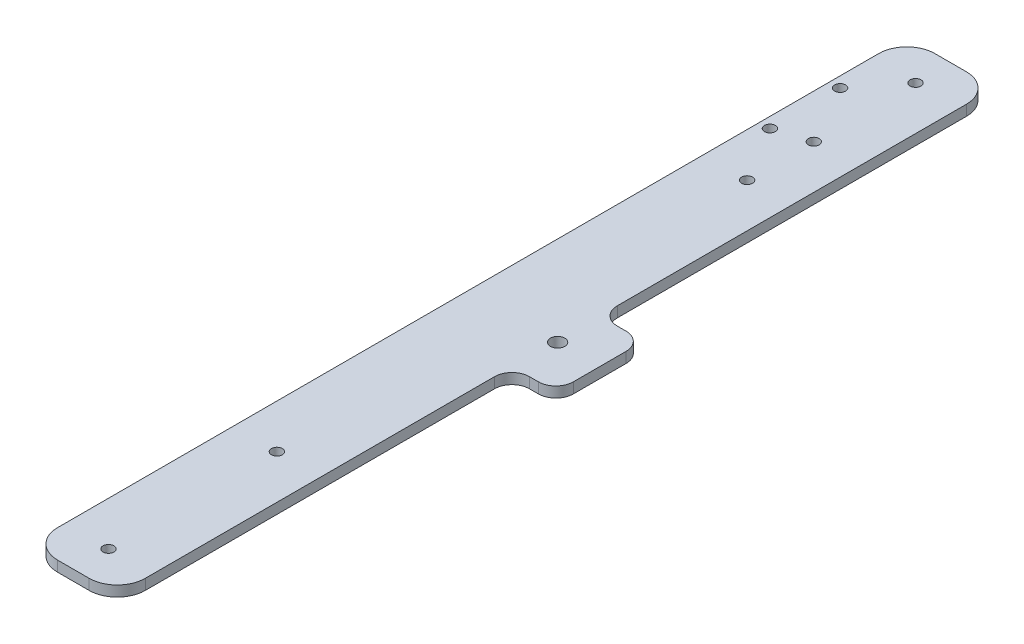
ISO-10303-21;
HEADER;
FILE_DESCRIPTION(('STEP AP214'),'2;1');
FILE_NAME('part.step','',(''),(''),'','','');
FILE_SCHEMA(('AUTOMOTIVE_DESIGN { 1 0 10303 214 1 1 1 1 }'));
ENDSEC;
DATA;
#1=APPLICATION_CONTEXT('core data for automotive mechanical design processes');
#2=APPLICATION_PROTOCOL_DEFINITION('international standard','automotive_design',2000,#1);
#3=PRODUCT_CONTEXT('',#1,'mechanical');
#4=PRODUCT('Part','Part','',(#3));
#5=PRODUCT_RELATED_PRODUCT_CATEGORY('part','',(#4));
#6=PRODUCT_DEFINITION_FORMATION('','',#4);
#7=PRODUCT_DEFINITION_CONTEXT('part definition',#1,'design');
#8=PRODUCT_DEFINITION('design','',#6,#7);
#9=PRODUCT_DEFINITION_SHAPE('','',#8);
#10=(LENGTH_UNIT() NAMED_UNIT(*) SI_UNIT(.MILLI.,.METRE.));
#11=(NAMED_UNIT(*) PLANE_ANGLE_UNIT() SI_UNIT($,.RADIAN.));
#12=(NAMED_UNIT(*) SI_UNIT($,.STERADIAN.) SOLID_ANGLE_UNIT());
#13=UNCERTAINTY_MEASURE_WITH_UNIT(LENGTH_MEASURE(1.E-05),#10,'distance_accuracy_value','');
#14=(GEOMETRIC_REPRESENTATION_CONTEXT(3) GLOBAL_UNCERTAINTY_ASSIGNED_CONTEXT((#13)) GLOBAL_UNIT_ASSIGNED_CONTEXT((#10,
#11,#12)) REPRESENTATION_CONTEXT('',''));
#15=CARTESIAN_POINT('',(0.,0.,0.));
#16=DIRECTION('',(0.,0.,1.));
#17=DIRECTION('',(1.,0.,0.));
#18=AXIS2_PLACEMENT_3D('',#15,#16,#17);
#19=CARTESIAN_POINT('',(12.5,3.,-125.));
#20=DIRECTION('',(-1.,0.,0.));
#21=DIRECTION('',(0.,0.,1.));
#22=AXIS2_PLACEMENT_3D('',#19,#20,#21);
#23=PLANE('',#22);
#24=DIRECTION('',(0.,0.,-1.));
#25=VECTOR('',#24,1.);
#26=CARTESIAN_POINT('',(12.5,3.,-125.));
#27=LINE('',#26,#25);
#28=CARTESIAN_POINT('',(12.5,3.,117.));
#29=VERTEX_POINT('',#28);
#30=CARTESIAN_POINT('',(12.5,3.,17.5));
#31=VERTEX_POINT('',#30);
#32=EDGE_CURVE('E250',#29,#31,#27,.T.);
#33=ORIENTED_EDGE('',*,*,#32,.F.);
#34=DIRECTION('',(0.,-1.,0.));
#35=VECTOR('',#34,1.);
#36=CARTESIAN_POINT('',(12.5,3.,117.));
#37=LINE('',#36,#35);
#38=CARTESIAN_POINT('',(12.5,0.,117.));
#39=VERTEX_POINT('',#38);
#40=EDGE_CURVE('E11',#29,#39,#37,.T.);
#41=ORIENTED_EDGE('',*,*,#40,.T.);
#42=DIRECTION('',(0.,0.,-1.));
#43=VECTOR('',#42,1.);
#44=CARTESIAN_POINT('',(12.5,0.,-125.));
#45=LINE('',#44,#43);
#46=CARTESIAN_POINT('',(12.5,0.,17.5));
#47=VERTEX_POINT('',#46);
#48=EDGE_CURVE('E152',#39,#47,#45,.T.);
#49=ORIENTED_EDGE('',*,*,#48,.T.);
#50=DIRECTION('',(0.,1.,0.));
#51=VECTOR('',#50,1.);
#52=CARTESIAN_POINT('',(12.5,3.,17.5));
#53=LINE('',#52,#51);
#54=EDGE_CURVE('E155',#47,#31,#53,.T.);
#55=ORIENTED_EDGE('',*,*,#54,.T.);
#56=EDGE_LOOP('',(#33,#41,#49,#55));
#57=FACE_BOUND('',#56,.T.);
#58=ADVANCED_FACE('F37',(#57),#23,.F.);
#59=CARTESIAN_POINT('',(12.5,0.,-17.5));
#60=VERTEX_POINT('',#59);
#61=CARTESIAN_POINT('',(12.5,0.,-117.));
#62=VERTEX_POINT('',#61);
#63=EDGE_CURVE('E159',#60,#62,#45,.T.);
#64=ORIENTED_EDGE('',*,*,#63,.T.);
#65=DIRECTION('',(0.,-1.,0.));
#66=VECTOR('',#65,1.);
#67=CARTESIAN_POINT('',(12.5,3.,-117.));
#68=LINE('',#67,#66);
#69=CARTESIAN_POINT('',(12.5,3.,-117.));
#70=VERTEX_POINT('',#69);
#71=EDGE_CURVE('E238',#62,#70,#68,.F.);
#72=ORIENTED_EDGE('',*,*,#71,.T.);
#73=CARTESIAN_POINT('',(12.5,3.,-17.5));
#74=VERTEX_POINT('',#73);
#75=EDGE_CURVE('E247',#74,#70,#27,.T.);
#76=ORIENTED_EDGE('',*,*,#75,.F.);
#77=DIRECTION('',(0.,-1.,0.));
#78=VECTOR('',#77,1.);
#79=CARTESIAN_POINT('',(12.5,3.,-17.5));
#80=LINE('',#79,#78);
#81=EDGE_CURVE('E201',#74,#60,#80,.T.);
#82=ORIENTED_EDGE('',*,*,#81,.T.);
#83=EDGE_LOOP('',(#64,#72,#76,#82));
#84=FACE_BOUND('',#83,.T.);
#85=ADVANCED_FACE('F352',(#84),#23,.F.);
#86=CARTESIAN_POINT('',(-12.5,3.,-125.));
#87=DIRECTION('',(0.,0.,1.));
#88=DIRECTION('',(1.,0.,0.));
#89=AXIS2_PLACEMENT_3D('',#86,#87,#88);
#90=PLANE('',#89);
#91=DIRECTION('',(-1.,0.,0.));
#92=VECTOR('',#91,1.);
#93=CARTESIAN_POINT('',(-12.5,0.,-125.));
#94=LINE('',#93,#92);
#95=CARTESIAN_POINT('',(4.49999999999999,0.,-125.));
#96=VERTEX_POINT('',#95);
#97=CARTESIAN_POINT('',(-4.5,0.,-125.));
#98=VERTEX_POINT('',#97);
#99=EDGE_CURVE('E158',#96,#98,#94,.T.);
#100=ORIENTED_EDGE('',*,*,#99,.T.);
#101=DIRECTION('',(0.,-1.,0.));
#102=VECTOR('',#101,1.);
#103=CARTESIAN_POINT('',(-4.5,3.,-125.));
#104=LINE('',#103,#102);
#105=CARTESIAN_POINT('',(-4.5,3.,-125.));
#106=VERTEX_POINT('',#105);
#107=EDGE_CURVE('E229',#98,#106,#104,.F.);
#108=ORIENTED_EDGE('',*,*,#107,.T.);
#109=DIRECTION('',(-1.,0.,0.));
#110=VECTOR('',#109,1.);
#111=CARTESIAN_POINT('',(-12.5,3.,-125.));
#112=LINE('',#111,#110);
#113=CARTESIAN_POINT('',(4.49999999999999,3.,-125.));
#114=VERTEX_POINT('',#113);
#115=EDGE_CURVE('E259',#114,#106,#112,.T.);
#116=ORIENTED_EDGE('',*,*,#115,.F.);
#117=DIRECTION('',(0.,-1.,0.));
#118=VECTOR('',#117,1.);
#119=CARTESIAN_POINT('',(4.49999999999999,3.,-125.));
#120=LINE('',#119,#118);
#121=EDGE_CURVE('E226',#114,#96,#120,.T.);
#122=ORIENTED_EDGE('',*,*,#121,.T.);
#123=EDGE_LOOP('',(#100,#108,#116,#122));
#124=FACE_BOUND('',#123,.T.);
#125=ADVANCED_FACE('F357',(#124),#90,.F.);
#126=CARTESIAN_POINT('',(-12.5,3.,-125.));
#127=DIRECTION('',(1.,0.,0.));
#128=DIRECTION('',(0.,0.,-1.));
#129=AXIS2_PLACEMENT_3D('',#126,#127,#128);
#130=PLANE('',#129);
#131=DIRECTION('',(0.,0.,1.));
#132=VECTOR('',#131,1.);
#133=CARTESIAN_POINT('',(-12.5,3.,-125.));
#134=LINE('',#133,#132);
#135=CARTESIAN_POINT('',(-12.5,3.,-117.));
#136=VERTEX_POINT('',#135);
#137=CARTESIAN_POINT('',(-12.5,3.,117.));
#138=VERTEX_POINT('',#137);
#139=EDGE_CURVE('E181',#136,#138,#134,.T.);
#140=ORIENTED_EDGE('',*,*,#139,.F.);
#141=DIRECTION('',(0.,-1.,0.));
#142=VECTOR('',#141,1.);
#143=CARTESIAN_POINT('',(-12.5,3.,-117.));
#144=LINE('',#143,#142);
#145=CARTESIAN_POINT('',(-12.5,0.,-117.));
#146=VERTEX_POINT('',#145);
#147=EDGE_CURVE('E215',#136,#146,#144,.T.);
#148=ORIENTED_EDGE('',*,*,#147,.T.);
#149=DIRECTION('',(0.,0.,1.));
#150=VECTOR('',#149,1.);
#151=CARTESIAN_POINT('',(-12.5,0.,-125.));
#152=LINE('',#151,#150);
#153=CARTESIAN_POINT('',(-12.5,0.,117.));
#154=VERTEX_POINT('',#153);
#155=EDGE_CURVE('E248',#146,#154,#152,.T.);
#156=ORIENTED_EDGE('',*,*,#155,.T.);
#157=DIRECTION('',(0.,-1.,0.));
#158=VECTOR('',#157,1.);
#159=CARTESIAN_POINT('',(-12.5,3.,117.));
#160=LINE('',#159,#158);
#161=EDGE_CURVE('E213',#154,#138,#160,.F.);
#162=ORIENTED_EDGE('',*,*,#161,.T.);
#163=EDGE_LOOP('',(#140,#148,#156,#162));
#164=FACE_BOUND('',#163,.T.);
#165=ADVANCED_FACE('F393',(#164),#130,.F.);
#166=CARTESIAN_POINT('',(-12.5,3.,125.));
#167=DIRECTION('',(0.,0.,-1.));
#168=DIRECTION('',(-1.,0.,0.));
#169=AXIS2_PLACEMENT_3D('',#166,#167,#168);
#170=PLANE('',#169);
#171=DIRECTION('',(1.,0.,0.));
#172=VECTOR('',#171,1.);
#173=CARTESIAN_POINT('',(-12.5,3.,125.));
#174=LINE('',#173,#172);
#175=CARTESIAN_POINT('',(-4.49999999999998,3.,125.));
#176=VERTEX_POINT('',#175);
#177=CARTESIAN_POINT('',(4.50000000000002,3.,125.));
#178=VERTEX_POINT('',#177);
#179=EDGE_CURVE('E177',#176,#178,#174,.T.);
#180=ORIENTED_EDGE('',*,*,#179,.F.);
#181=DIRECTION('',(0.,-1.,0.));
#182=VECTOR('',#181,1.);
#183=CARTESIAN_POINT('',(-4.49999999999998,3.,125.));
#184=LINE('',#183,#182);
#185=CARTESIAN_POINT('',(-4.49999999999998,0.,125.));
#186=VERTEX_POINT('',#185);
#187=EDGE_CURVE('E45',#176,#186,#184,.T.);
#188=ORIENTED_EDGE('',*,*,#187,.T.);
#189=DIRECTION('',(1.,0.,0.));
#190=VECTOR('',#189,1.);
#191=CARTESIAN_POINT('',(-12.5,0.,125.));
#192=LINE('',#191,#190);
#193=CARTESIAN_POINT('',(4.50000000000002,0.,125.));
#194=VERTEX_POINT('',#193);
#195=EDGE_CURVE('E184',#186,#194,#192,.T.);
#196=ORIENTED_EDGE('',*,*,#195,.T.);
#197=DIRECTION('',(0.,-1.,0.));
#198=VECTOR('',#197,1.);
#199=CARTESIAN_POINT('',(4.50000000000002,3.,125.));
#200=LINE('',#199,#198);
#201=EDGE_CURVE('E60',#194,#178,#200,.F.);
#202=ORIENTED_EDGE('',*,*,#201,.T.);
#203=EDGE_LOOP('',(#180,#188,#196,#202));
#204=FACE_BOUND('',#203,.T.);
#205=ADVANCED_FACE('F243',(#204),#170,.F.);
#206=CARTESIAN_POINT('',(0.,3.,0.));
#207=DIRECTION('',(0.,1.,0.));
#208=DIRECTION('',(0.,0.,1.));
#209=AXIS2_PLACEMENT_3D('',#206,#207,#208);
#210=PLANE('',#209);
#211=CARTESIAN_POINT('',(1.28369537222284E-13,3.,-86.0000000000001));
#212=DIRECTION('',(0.,1.,0.));
#213=DIRECTION('',(0.,0.,1.));
#214=AXIS2_PLACEMENT_3D('',#211,#212,#213);
#215=CIRCLE('',#214,1.55);
#216=CARTESIAN_POINT('',(1.28369537222284E-13,3.,-84.4500000000001));
#217=VERTEX_POINT('',#216);
#218=EDGE_CURVE('E320',#217,#217,#215,.T.);
#219=ORIENTED_EDGE('',*,*,#218,.F.);
#220=EDGE_LOOP('',(#219));
#221=FACE_BOUND('',#220,.T.);
#222=CARTESIAN_POINT('',(13.,3.,0.));
#223=DIRECTION('',(0.,1.,0.));
#224=DIRECTION('',(0.,0.,1.));
#225=AXIS2_PLACEMENT_3D('',#222,#223,#224);
#226=CIRCLE('',#225,2.05);
#227=CARTESIAN_POINT('',(13.,3.,2.04999999999999));
#228=VERTEX_POINT('',#227);
#229=EDGE_CURVE('E307',#228,#228,#226,.T.);
#230=ORIENTED_EDGE('',*,*,#229,.F.);
#231=EDGE_LOOP('',(#230));
#232=FACE_BOUND('',#231,.T.);
#233=ORIENTED_EDGE('',*,*,#115,.T.);
#234=CARTESIAN_POINT('',(-4.5,3.,-117.));
#235=DIRECTION('',(0.,1.,0.));
#236=DIRECTION('',(0.,0.,1.));
#237=AXIS2_PLACEMENT_3D('',#234,#235,#236);
#238=CIRCLE('',#237,8.);
#239=EDGE_CURVE('E236',#106,#136,#238,.T.);
#240=ORIENTED_EDGE('',*,*,#239,.T.);
#241=ORIENTED_EDGE('',*,*,#139,.T.);
#242=CARTESIAN_POINT('',(-4.49999999999998,3.,117.));
#243=DIRECTION('',(0.,1.,0.));
#244=DIRECTION('',(0.,0.,1.));
#245=AXIS2_PLACEMENT_3D('',#242,#243,#244);
#246=CIRCLE('',#245,8.);
#247=EDGE_CURVE('E232',#138,#176,#246,.T.);
#248=ORIENTED_EDGE('',*,*,#247,.T.);
#249=ORIENTED_EDGE('',*,*,#179,.T.);
#250=CARTESIAN_POINT('',(4.50000000000002,3.,117.));
#251=DIRECTION('',(0.,1.,0.));
#252=DIRECTION('',(0.,0.,1.));
#253=AXIS2_PLACEMENT_3D('',#250,#251,#252);
#254=CIRCLE('',#253,8.);
#255=EDGE_CURVE('E52',#178,#29,#254,.T.);
#256=ORIENTED_EDGE('',*,*,#255,.T.);
#257=ORIENTED_EDGE('',*,*,#32,.T.);
#258=CARTESIAN_POINT('',(17.5,3.,17.5));
#259=DIRECTION('',(0.,1.,0.));
#260=DIRECTION('',(0.,0.,1.));
#261=AXIS2_PLACEMENT_3D('',#258,#259,#260);
#262=CIRCLE('',#261,5.);
#263=CARTESIAN_POINT('',(17.5,3.,12.5));
#264=VERTEX_POINT('',#263);
#265=EDGE_CURVE('E172',#31,#264,#262,.F.);
#266=ORIENTED_EDGE('',*,*,#265,.T.);
#267=DIRECTION('',(-1.,0.,0.));
#268=VECTOR('',#267,1.);
#269=CARTESIAN_POINT('',(25.,3.,12.5));
#270=LINE('',#269,#268);
#271=CARTESIAN_POINT('',(20.,3.,12.5));
#272=VERTEX_POINT('',#271);
#273=EDGE_CURVE('E296',#272,#264,#270,.T.);
#274=ORIENTED_EDGE('',*,*,#273,.F.);
#275=CARTESIAN_POINT('',(20.,3.,7.5));
#276=DIRECTION('',(0.,1.,0.));
#277=DIRECTION('',(0.,0.,1.));
#278=AXIS2_PLACEMENT_3D('',#275,#276,#277);
#279=CIRCLE('',#278,5.);
#280=CARTESIAN_POINT('',(25.,3.,7.5));
#281=VERTEX_POINT('',#280);
#282=EDGE_CURVE('E199',#272,#281,#279,.T.);
#283=ORIENTED_EDGE('',*,*,#282,.T.);
#284=DIRECTION('',(0.,0.,1.));
#285=VECTOR('',#284,1.);
#286=CARTESIAN_POINT('',(25.,3.,12.5));
#287=LINE('',#286,#285);
#288=CARTESIAN_POINT('',(25.,3.,-7.5));
#289=VERTEX_POINT('',#288);
#290=EDGE_CURVE('E310',#289,#281,#287,.T.);
#291=ORIENTED_EDGE('',*,*,#290,.F.);
#292=CARTESIAN_POINT('',(20.,3.,-7.5));
#293=DIRECTION('',(0.,1.,0.));
#294=DIRECTION('',(0.,0.,1.));
#295=AXIS2_PLACEMENT_3D('',#292,#293,#294);
#296=CIRCLE('',#295,5.);
#297=CARTESIAN_POINT('',(20.,3.,-12.5));
#298=VERTEX_POINT('',#297);
#299=EDGE_CURVE('E197',#289,#298,#296,.T.);
#300=ORIENTED_EDGE('',*,*,#299,.T.);
#301=DIRECTION('',(1.,0.,0.));
#302=VECTOR('',#301,1.);
#303=CARTESIAN_POINT('',(25.,3.,-12.5));
#304=LINE('',#303,#302);
#305=CARTESIAN_POINT('',(17.5,3.,-12.5));
#306=VERTEX_POINT('',#305);
#307=EDGE_CURVE('E300',#306,#298,#304,.T.);
#308=ORIENTED_EDGE('',*,*,#307,.F.);
#309=CARTESIAN_POINT('',(17.5,3.,-17.5));
#310=DIRECTION('',(0.,1.,0.));
#311=DIRECTION('',(0.,0.,1.));
#312=AXIS2_PLACEMENT_3D('',#309,#310,#311);
#313=CIRCLE('',#312,5.);
#314=EDGE_CURVE('E211',#306,#74,#313,.F.);
#315=ORIENTED_EDGE('',*,*,#314,.T.);
#316=ORIENTED_EDGE('',*,*,#75,.T.);
#317=CARTESIAN_POINT('',(4.49999999999999,3.,-117.));
#318=DIRECTION('',(0.,1.,0.));
#319=DIRECTION('',(0.,0.,1.));
#320=AXIS2_PLACEMENT_3D('',#317,#318,#319);
#321=CIRCLE('',#320,8.);
#322=EDGE_CURVE('E234',#70,#114,#321,.T.);
#323=ORIENTED_EDGE('',*,*,#322,.T.);
#324=EDGE_LOOP('',(#233,#240,#241,#248,#249,#256,#257,#266,#274,#283,#291,#300,#308,#315,#316,#323));
#325=FACE_BOUND('',#324,.T.);
#326=CARTESIAN_POINT('',(-9.50000000000001,3.,-83.));
#327=DIRECTION('',(0.,1.,0.));
#328=DIRECTION('',(0.,0.,1.));
#329=AXIS2_PLACEMENT_3D('',#326,#327,#328);
#330=CIRCLE('',#329,1.55);
#331=CARTESIAN_POINT('',(-9.50000000000001,3.,-81.45));
#332=VERTEX_POINT('',#331);
#333=EDGE_CURVE('E266',#332,#332,#330,.T.);
#334=ORIENTED_EDGE('',*,*,#333,.F.);
#335=EDGE_LOOP('',(#334));
#336=FACE_BOUND('',#335,.T.);
#337=CARTESIAN_POINT('',(-9.50000000000001,3.,-103.));
#338=DIRECTION('',(0.,1.,0.));
#339=DIRECTION('',(0.,0.,1.));
#340=AXIS2_PLACEMENT_3D('',#337,#338,#339);
#341=CIRCLE('',#340,1.55);
#342=CARTESIAN_POINT('',(-9.50000000000001,3.,-101.45));
#343=VERTEX_POINT('',#342);
#344=EDGE_CURVE('E289',#343,#343,#341,.T.);
#345=ORIENTED_EDGE('',*,*,#344,.F.);
#346=EDGE_LOOP('',(#345));
#347=FACE_BOUND('',#346,.T.);
#348=CARTESIAN_POINT('',(0.,3.,-115.));
#349=DIRECTION('',(0.,-1.,0.));
#350=DIRECTION('',(0.,0.,-1.));
#351=AXIS2_PLACEMENT_3D('',#348,#349,#350);
#352=CIRCLE('',#351,1.54999999999999);
#353=CARTESIAN_POINT('',(0.,3.,-116.55));
#354=VERTEX_POINT('',#353);
#355=EDGE_CURVE('E284',#354,#354,#352,.T.);
#356=ORIENTED_EDGE('',*,*,#355,.T.);
#357=EDGE_LOOP('',(#356));
#358=FACE_BOUND('',#357,.T.);
#359=CARTESIAN_POINT('',(0.,3.,-67.0000000000001));
#360=DIRECTION('',(0.,-1.,0.));
#361=DIRECTION('',(0.,0.,-1.));
#362=AXIS2_PLACEMENT_3D('',#359,#360,#361);
#363=CIRCLE('',#362,1.54999999999999);
#364=CARTESIAN_POINT('',(0.,3.,-68.5500000000001));
#365=VERTEX_POINT('',#364);
#366=EDGE_CURVE('E278',#365,#365,#363,.T.);
#367=ORIENTED_EDGE('',*,*,#366,.T.);
#368=EDGE_LOOP('',(#367));
#369=FACE_BOUND('',#368,.T.);
#370=CARTESIAN_POINT('',(0.,3.,67.0000000000001));
#371=DIRECTION('',(0.,-1.,0.));
#372=DIRECTION('',(0.,0.,-1.));
#373=AXIS2_PLACEMENT_3D('',#370,#371,#372);
#374=CIRCLE('',#373,1.54999999999999);
#375=CARTESIAN_POINT('',(0.,3.,65.4500000000001));
#376=VERTEX_POINT('',#375);
#377=EDGE_CURVE('E272',#376,#376,#374,.T.);
#378=ORIENTED_EDGE('',*,*,#377,.T.);
#379=EDGE_LOOP('',(#378));
#380=FACE_BOUND('',#379,.T.);
#381=CARTESIAN_POINT('',(0.,3.,115.));
#382=DIRECTION('',(0.,-1.,0.));
#383=DIRECTION('',(0.,0.,-1.));
#384=AXIS2_PLACEMENT_3D('',#381,#382,#383);
#385=CIRCLE('',#384,1.54999999999999);
#386=CARTESIAN_POINT('',(0.,3.,113.45));
#387=VERTEX_POINT('',#386);
#388=EDGE_CURVE('E265',#387,#387,#385,.T.);
#389=ORIENTED_EDGE('',*,*,#388,.T.);
#390=EDGE_LOOP('',(#389));
#391=FACE_BOUND('',#390,.T.);
#392=ADVANCED_FACE('F332',(#221,#232,#325,#336,#347,#358,#369,#380,#391),#210,.T.);
#393=CARTESIAN_POINT('',(0.,0.,0.));
#394=DIRECTION('',(0.,1.,0.));
#395=DIRECTION('',(0.,0.,1.));
#396=AXIS2_PLACEMENT_3D('',#393,#394,#395);
#397=PLANE('',#396);
#398=CARTESIAN_POINT('',(1.28369537222284E-13,0.,-86.0000000000001));
#399=DIRECTION('',(0.,-1.,0.));
#400=DIRECTION('',(0.,0.,-1.));
#401=AXIS2_PLACEMENT_3D('',#398,#399,#400);
#402=CIRCLE('',#401,1.55);
#403=CARTESIAN_POINT('',(1.28369537222284E-13,0.,-87.5500000000001));
#404=VERTEX_POINT('',#403);
#405=EDGE_CURVE('E323',#404,#404,#402,.T.);
#406=ORIENTED_EDGE('',*,*,#405,.F.);
#407=EDGE_LOOP('',(#406));
#408=FACE_BOUND('',#407,.T.);
#409=CARTESIAN_POINT('',(13.,0.,0.));
#410=DIRECTION('',(0.,-1.,0.));
#411=DIRECTION('',(0.,0.,-1.));
#412=AXIS2_PLACEMENT_3D('',#409,#410,#411);
#413=CIRCLE('',#412,2.05);
#414=CARTESIAN_POINT('',(13.,0.,-2.05000000000001));
#415=VERTEX_POINT('',#414);
#416=EDGE_CURVE('E317',#415,#415,#413,.T.);
#417=ORIENTED_EDGE('',*,*,#416,.F.);
#418=EDGE_LOOP('',(#417));
#419=FACE_BOUND('',#418,.T.);
#420=ORIENTED_EDGE('',*,*,#155,.F.);
#421=CARTESIAN_POINT('',(-4.5,0.,-117.));
#422=DIRECTION('',(0.,1.,0.));
#423=DIRECTION('',(0.,0.,1.));
#424=AXIS2_PLACEMENT_3D('',#421,#422,#423);
#425=CIRCLE('',#424,8.);
#426=EDGE_CURVE('E224',#146,#98,#425,.F.);
#427=ORIENTED_EDGE('',*,*,#426,.T.);
#428=ORIENTED_EDGE('',*,*,#99,.F.);
#429=CARTESIAN_POINT('',(4.49999999999999,0.,-117.));
#430=DIRECTION('',(0.,1.,0.));
#431=DIRECTION('',(0.,0.,1.));
#432=AXIS2_PLACEMENT_3D('',#429,#430,#431);
#433=CIRCLE('',#432,8.);
#434=EDGE_CURVE('E222',#96,#62,#433,.F.);
#435=ORIENTED_EDGE('',*,*,#434,.T.);
#436=ORIENTED_EDGE('',*,*,#63,.F.);
#437=CARTESIAN_POINT('',(17.5,0.,-17.5));
#438=DIRECTION('',(0.,1.,0.));
#439=DIRECTION('',(0.,0.,1.));
#440=AXIS2_PLACEMENT_3D('',#437,#438,#439);
#441=CIRCLE('',#440,5.);
#442=CARTESIAN_POINT('',(17.5,0.,-12.5));
#443=VERTEX_POINT('',#442);
#444=EDGE_CURVE('E171',#60,#443,#441,.T.);
#445=ORIENTED_EDGE('',*,*,#444,.T.);
#446=DIRECTION('',(1.,0.,0.));
#447=VECTOR('',#446,1.);
#448=CARTESIAN_POINT('',(25.,0.,-12.5));
#449=LINE('',#448,#447);
#450=CARTESIAN_POINT('',(20.,0.,-12.5));
#451=VERTEX_POINT('',#450);
#452=EDGE_CURVE('E304',#443,#451,#449,.T.);
#453=ORIENTED_EDGE('',*,*,#452,.T.);
#454=CARTESIAN_POINT('',(20.,0.,-7.5));
#455=DIRECTION('',(0.,1.,0.));
#456=DIRECTION('',(0.,0.,1.));
#457=AXIS2_PLACEMENT_3D('',#454,#455,#456);
#458=CIRCLE('',#457,5.);
#459=CARTESIAN_POINT('',(25.,0.,-7.5));
#460=VERTEX_POINT('',#459);
#461=EDGE_CURVE('E193',#451,#460,#458,.F.);
#462=ORIENTED_EDGE('',*,*,#461,.T.);
#463=DIRECTION('',(0.,0.,1.));
#464=VECTOR('',#463,1.);
#465=CARTESIAN_POINT('',(25.,0.,12.5));
#466=LINE('',#465,#464);
#467=CARTESIAN_POINT('',(25.,0.,7.5));
#468=VERTEX_POINT('',#467);
#469=EDGE_CURVE('E301',#460,#468,#466,.T.);
#470=ORIENTED_EDGE('',*,*,#469,.T.);
#471=CARTESIAN_POINT('',(20.,0.,7.5));
#472=DIRECTION('',(0.,1.,0.));
#473=DIRECTION('',(0.,0.,1.));
#474=AXIS2_PLACEMENT_3D('',#471,#472,#473);
#475=CIRCLE('',#474,5.);
#476=CARTESIAN_POINT('',(20.,0.,12.5));
#477=VERTEX_POINT('',#476);
#478=EDGE_CURVE('E195',#468,#477,#475,.F.);
#479=ORIENTED_EDGE('',*,*,#478,.T.);
#480=DIRECTION('',(-1.,0.,0.));
#481=VECTOR('',#480,1.);
#482=CARTESIAN_POINT('',(25.,0.,12.5));
#483=LINE('',#482,#481);
#484=CARTESIAN_POINT('',(17.5,0.,12.5));
#485=VERTEX_POINT('',#484);
#486=EDGE_CURVE('E168',#477,#485,#483,.T.);
#487=ORIENTED_EDGE('',*,*,#486,.T.);
#488=CARTESIAN_POINT('',(17.5,0.,17.5));
#489=DIRECTION('',(0.,1.,0.));
#490=DIRECTION('',(0.,0.,1.));
#491=AXIS2_PLACEMENT_3D('',#488,#489,#490);
#492=CIRCLE('',#491,5.);
#493=EDGE_CURVE('E163',#485,#47,#492,.T.);
#494=ORIENTED_EDGE('',*,*,#493,.T.);
#495=ORIENTED_EDGE('',*,*,#48,.F.);
#496=CARTESIAN_POINT('',(4.50000000000002,0.,117.));
#497=DIRECTION('',(0.,1.,0.));
#498=DIRECTION('',(0.,0.,1.));
#499=AXIS2_PLACEMENT_3D('',#496,#497,#498);
#500=CIRCLE('',#499,8.);
#501=EDGE_CURVE('E218',#39,#194,#500,.F.);
#502=ORIENTED_EDGE('',*,*,#501,.T.);
#503=ORIENTED_EDGE('',*,*,#195,.F.);
#504=CARTESIAN_POINT('',(-4.49999999999998,0.,117.));
#505=DIRECTION('',(0.,1.,0.));
#506=DIRECTION('',(0.,0.,1.));
#507=AXIS2_PLACEMENT_3D('',#504,#505,#506);
#508=CIRCLE('',#507,8.);
#509=EDGE_CURVE('E220',#186,#154,#508,.F.);
#510=ORIENTED_EDGE('',*,*,#509,.T.);
#511=EDGE_LOOP('',(#420,#427,#428,#435,#436,#445,#453,#462,#470,#479,#487,#494,#495,#502,#503,#510));
#512=FACE_BOUND('',#511,.T.);
#513=CARTESIAN_POINT('',(-9.50000000000001,0.,-83.));
#514=DIRECTION('',(0.,-1.,0.));
#515=DIRECTION('',(0.,0.,-1.));
#516=AXIS2_PLACEMENT_3D('',#513,#514,#515);
#517=CIRCLE('',#516,1.55);
#518=CARTESIAN_POINT('',(-9.50000000000001,0.,-84.55));
#519=VERTEX_POINT('',#518);
#520=EDGE_CURVE('E292',#519,#519,#517,.T.);
#521=ORIENTED_EDGE('',*,*,#520,.F.);
#522=EDGE_LOOP('',(#521));
#523=FACE_BOUND('',#522,.T.);
#524=CARTESIAN_POINT('',(-9.50000000000001,0.,-103.));
#525=DIRECTION('',(0.,-1.,0.));
#526=DIRECTION('',(0.,0.,-1.));
#527=AXIS2_PLACEMENT_3D('',#524,#525,#526);
#528=CIRCLE('',#527,1.55);
#529=CARTESIAN_POINT('',(-9.50000000000001,0.,-104.55));
#530=VERTEX_POINT('',#529);
#531=EDGE_CURVE('E293',#530,#530,#528,.T.);
#532=ORIENTED_EDGE('',*,*,#531,.F.);
#533=EDGE_LOOP('',(#532));
#534=FACE_BOUND('',#533,.T.);
#535=CARTESIAN_POINT('',(0.,0.,-115.));
#536=DIRECTION('',(0.,-1.,0.));
#537=DIRECTION('',(0.,0.,-1.));
#538=AXIS2_PLACEMENT_3D('',#535,#536,#537);
#539=CIRCLE('',#538,1.54999999999999);
#540=CARTESIAN_POINT('',(0.,0.,-116.55));
#541=VERTEX_POINT('',#540);
#542=EDGE_CURVE('E281',#541,#541,#539,.T.);
#543=ORIENTED_EDGE('',*,*,#542,.F.);
#544=EDGE_LOOP('',(#543));
#545=FACE_BOUND('',#544,.T.);
#546=CARTESIAN_POINT('',(0.,0.,-67.0000000000001));
#547=DIRECTION('',(0.,-1.,0.));
#548=DIRECTION('',(0.,0.,-1.));
#549=AXIS2_PLACEMENT_3D('',#546,#547,#548);
#550=CIRCLE('',#549,1.54999999999999);
#551=CARTESIAN_POINT('',(0.,0.,-68.5500000000001));
#552=VERTEX_POINT('',#551);
#553=EDGE_CURVE('E275',#552,#552,#550,.T.);
#554=ORIENTED_EDGE('',*,*,#553,.F.);
#555=EDGE_LOOP('',(#554));
#556=FACE_BOUND('',#555,.T.);
#557=CARTESIAN_POINT('',(0.,0.,67.0000000000001));
#558=DIRECTION('',(0.,-1.,0.));
#559=DIRECTION('',(0.,0.,-1.));
#560=AXIS2_PLACEMENT_3D('',#557,#558,#559);
#561=CIRCLE('',#560,1.54999999999999);
#562=CARTESIAN_POINT('',(0.,0.,65.4500000000001));
#563=VERTEX_POINT('',#562);
#564=EDGE_CURVE('E269',#563,#563,#561,.T.);
#565=ORIENTED_EDGE('',*,*,#564,.F.);
#566=EDGE_LOOP('',(#565));
#567=FACE_BOUND('',#566,.T.);
#568=CARTESIAN_POINT('',(0.,0.,115.));
#569=DIRECTION('',(0.,-1.,0.));
#570=DIRECTION('',(0.,0.,-1.));
#571=AXIS2_PLACEMENT_3D('',#568,#569,#570);
#572=CIRCLE('',#571,1.54999999999999);
#573=CARTESIAN_POINT('',(0.,0.,113.45));
#574=VERTEX_POINT('',#573);
#575=EDGE_CURVE('E262',#574,#574,#572,.T.);
#576=ORIENTED_EDGE('',*,*,#575,.F.);
#577=EDGE_LOOP('',(#576));
#578=FACE_BOUND('',#577,.T.);
#579=ADVANCED_FACE('F165',(#408,#419,#512,#523,#534,#545,#556,#567,#578),#397,.F.);
#580=CARTESIAN_POINT('',(0.,3.,115.));
#581=DIRECTION('',(0.,-1.,0.));
#582=DIRECTION('',(0.,0.,-1.));
#583=AXIS2_PLACEMENT_3D('',#580,#581,#582);
#584=CYLINDRICAL_SURFACE('',#583,1.54999999999999);
#585=ORIENTED_EDGE('',*,*,#388,.F.);
#586=EDGE_LOOP('',(#585));
#587=FACE_BOUND('',#586,.T.);
#588=ORIENTED_EDGE('',*,*,#575,.T.);
#589=EDGE_LOOP('',(#588));
#590=FACE_BOUND('',#589,.T.);
#591=ADVANCED_FACE('F331',(#587,#590),#584,.F.);
#592=CARTESIAN_POINT('',(0.,3.,67.0000000000001));
#593=DIRECTION('',(0.,-1.,0.));
#594=DIRECTION('',(0.,0.,-1.));
#595=AXIS2_PLACEMENT_3D('',#592,#593,#594);
#596=CYLINDRICAL_SURFACE('',#595,1.54999999999999);
#597=ORIENTED_EDGE('',*,*,#377,.F.);
#598=EDGE_LOOP('',(#597));
#599=FACE_BOUND('',#598,.T.);
#600=ORIENTED_EDGE('',*,*,#564,.T.);
#601=EDGE_LOOP('',(#600));
#602=FACE_BOUND('',#601,.T.);
#603=ADVANCED_FACE('F442',(#599,#602),#596,.F.);
#604=CARTESIAN_POINT('',(0.,3.,-67.0000000000001));
#605=DIRECTION('',(0.,-1.,0.));
#606=DIRECTION('',(0.,0.,-1.));
#607=AXIS2_PLACEMENT_3D('',#604,#605,#606);
#608=CYLINDRICAL_SURFACE('',#607,1.54999999999999);
#609=ORIENTED_EDGE('',*,*,#366,.F.);
#610=EDGE_LOOP('',(#609));
#611=FACE_BOUND('',#610,.T.);
#612=ORIENTED_EDGE('',*,*,#553,.T.);
#613=EDGE_LOOP('',(#612));
#614=FACE_BOUND('',#613,.T.);
#615=ADVANCED_FACE('F438',(#611,#614),#608,.F.);
#616=CARTESIAN_POINT('',(0.,3.,-115.));
#617=DIRECTION('',(0.,-1.,0.));
#618=DIRECTION('',(0.,0.,-1.));
#619=AXIS2_PLACEMENT_3D('',#616,#617,#618);
#620=CYLINDRICAL_SURFACE('',#619,1.54999999999999);
#621=ORIENTED_EDGE('',*,*,#355,.F.);
#622=EDGE_LOOP('',(#621));
#623=FACE_BOUND('',#622,.T.);
#624=ORIENTED_EDGE('',*,*,#542,.T.);
#625=EDGE_LOOP('',(#624));
#626=FACE_BOUND('',#625,.T.);
#627=ADVANCED_FACE('F434',(#623,#626),#620,.F.);
#628=CARTESIAN_POINT('',(-9.50000000000001,10.,-103.));
#629=DIRECTION('',(0.,-1.,0.));
#630=DIRECTION('',(0.,0.,-1.));
#631=AXIS2_PLACEMENT_3D('',#628,#629,#630);
#632=CYLINDRICAL_SURFACE('',#631,1.55);
#633=ORIENTED_EDGE('',*,*,#344,.T.);
#634=EDGE_LOOP('',(#633));
#635=FACE_BOUND('',#634,.T.);
#636=ORIENTED_EDGE('',*,*,#531,.T.);
#637=EDGE_LOOP('',(#636));
#638=FACE_BOUND('',#637,.T.);
#639=ADVANCED_FACE('F428',(#635,#638),#632,.F.);
#640=CARTESIAN_POINT('',(-9.50000000000001,10.,-83.));
#641=DIRECTION('',(0.,-1.,0.));
#642=DIRECTION('',(0.,0.,-1.));
#643=AXIS2_PLACEMENT_3D('',#640,#641,#642);
#644=CYLINDRICAL_SURFACE('',#643,1.55);
#645=ORIENTED_EDGE('',*,*,#333,.T.);
#646=EDGE_LOOP('',(#645));
#647=FACE_BOUND('',#646,.T.);
#648=ORIENTED_EDGE('',*,*,#520,.T.);
#649=EDGE_LOOP('',(#648));
#650=FACE_BOUND('',#649,.T.);
#651=ADVANCED_FACE('F422',(#647,#650),#644,.F.);
#652=CARTESIAN_POINT('',(25.,3.,12.5));
#653=DIRECTION('',(0.,0.,1.));
#654=DIRECTION('',(1.,0.,0.));
#655=AXIS2_PLACEMENT_3D('',#652,#653,#654);
#656=PLANE('',#655);
#657=ORIENTED_EDGE('',*,*,#273,.T.);
#658=DIRECTION('',(0.,1.,0.));
#659=VECTOR('',#658,1.);
#660=CARTESIAN_POINT('',(17.5,3.,12.5));
#661=LINE('',#660,#659);
#662=EDGE_CURVE('E179',#264,#485,#661,.F.);
#663=ORIENTED_EDGE('',*,*,#662,.T.);
#664=ORIENTED_EDGE('',*,*,#486,.F.);
#665=DIRECTION('',(0.,-1.,0.));
#666=VECTOR('',#665,1.);
#667=CARTESIAN_POINT('',(20.,3.,12.5));
#668=LINE('',#667,#666);
#669=EDGE_CURVE('E176',#477,#272,#668,.F.);
#670=ORIENTED_EDGE('',*,*,#669,.T.);
#671=EDGE_LOOP('',(#657,#663,#664,#670));
#672=FACE_BOUND('',#671,.T.);
#673=ADVANCED_FACE('F419',(#672),#656,.T.);
#674=CARTESIAN_POINT('',(25.,3.,-12.5));
#675=DIRECTION('',(0.,0.,-1.));
#676=DIRECTION('',(-1.,0.,0.));
#677=AXIS2_PLACEMENT_3D('',#674,#675,#676);
#678=PLANE('',#677);
#679=ORIENTED_EDGE('',*,*,#452,.F.);
#680=DIRECTION('',(0.,-1.,0.));
#681=VECTOR('',#680,1.);
#682=CARTESIAN_POINT('',(17.5,3.,-12.5));
#683=LINE('',#682,#681);
#684=EDGE_CURVE('E207',#443,#306,#683,.F.);
#685=ORIENTED_EDGE('',*,*,#684,.T.);
#686=ORIENTED_EDGE('',*,*,#307,.T.);
#687=DIRECTION('',(0.,-1.,0.));
#688=VECTOR('',#687,1.);
#689=CARTESIAN_POINT('',(20.,3.,-12.5));
#690=LINE('',#689,#688);
#691=EDGE_CURVE('E204',#298,#451,#690,.T.);
#692=ORIENTED_EDGE('',*,*,#691,.T.);
#693=EDGE_LOOP('',(#679,#685,#686,#692));
#694=FACE_BOUND('',#693,.T.);
#695=ADVANCED_FACE('F347',(#694),#678,.T.);
#696=CARTESIAN_POINT('',(25.,3.,12.5));
#697=DIRECTION('',(1.,0.,0.));
#698=DIRECTION('',(0.,0.,-1.));
#699=AXIS2_PLACEMENT_3D('',#696,#697,#698);
#700=PLANE('',#699);
#701=ORIENTED_EDGE('',*,*,#290,.T.);
#702=DIRECTION('',(0.,-1.,0.));
#703=VECTOR('',#702,1.);
#704=CARTESIAN_POINT('',(25.,3.,7.5));
#705=LINE('',#704,#703);
#706=EDGE_CURVE('E190',#281,#468,#705,.T.);
#707=ORIENTED_EDGE('',*,*,#706,.T.);
#708=ORIENTED_EDGE('',*,*,#469,.F.);
#709=DIRECTION('',(0.,-1.,0.));
#710=VECTOR('',#709,1.);
#711=CARTESIAN_POINT('',(25.,3.,-7.5));
#712=LINE('',#711,#710);
#713=EDGE_CURVE('E188',#460,#289,#712,.F.);
#714=ORIENTED_EDGE('',*,*,#713,.T.);
#715=EDGE_LOOP('',(#701,#707,#708,#714));
#716=FACE_BOUND('',#715,.T.);
#717=ADVANCED_FACE('F338',(#716),#700,.T.);
#718=CARTESIAN_POINT('',(13.,10.,0.));
#719=DIRECTION('',(0.,-1.,0.));
#720=DIRECTION('',(0.,0.,-1.));
#721=AXIS2_PLACEMENT_3D('',#718,#719,#720);
#722=CYLINDRICAL_SURFACE('',#721,2.05);
#723=ORIENTED_EDGE('',*,*,#229,.T.);
#724=EDGE_LOOP('',(#723));
#725=FACE_BOUND('',#724,.T.);
#726=ORIENTED_EDGE('',*,*,#416,.T.);
#727=EDGE_LOOP('',(#726));
#728=FACE_BOUND('',#727,.T.);
#729=ADVANCED_FACE('F336',(#725,#728),#722,.F.);
#730=CARTESIAN_POINT('',(1.28369537222284E-13,10.,-86.0000000000001));
#731=DIRECTION('',(0.,-1.,0.));
#732=DIRECTION('',(0.,0.,-1.));
#733=AXIS2_PLACEMENT_3D('',#730,#731,#732);
#734=CYLINDRICAL_SURFACE('',#733,1.55);
#735=ORIENTED_EDGE('',*,*,#218,.T.);
#736=EDGE_LOOP('',(#735));
#737=FACE_BOUND('',#736,.T.);
#738=ORIENTED_EDGE('',*,*,#405,.T.);
#739=EDGE_LOOP('',(#738));
#740=FACE_BOUND('',#739,.T.);
#741=ADVANCED_FACE('F327',(#737,#740),#734,.F.);
#742=CARTESIAN_POINT('',(17.5,3.,17.5));
#743=DIRECTION('',(0.,1.,0.));
#744=DIRECTION('',(0.,0.,1.));
#745=AXIS2_PLACEMENT_3D('',#742,#743,#744);
#746=CYLINDRICAL_SURFACE('',#745,5.);
#747=ORIENTED_EDGE('',*,*,#493,.F.);
#748=ORIENTED_EDGE('',*,*,#662,.F.);
#749=ORIENTED_EDGE('',*,*,#265,.F.);
#750=ORIENTED_EDGE('',*,*,#54,.F.);
#751=EDGE_LOOP('',(#747,#748,#749,#750));
#752=FACE_BOUND('',#751,.T.);
#753=ADVANCED_FACE('F175',(#752),#746,.F.);
#754=CARTESIAN_POINT('',(20.,3.,7.5));
#755=DIRECTION('',(0.,-1.,0.));
#756=DIRECTION('',(0.,0.,-1.));
#757=AXIS2_PLACEMENT_3D('',#754,#755,#756);
#758=CYLINDRICAL_SURFACE('',#757,5.);
#759=ORIENTED_EDGE('',*,*,#282,.F.);
#760=ORIENTED_EDGE('',*,*,#669,.F.);
#761=ORIENTED_EDGE('',*,*,#478,.F.);
#762=ORIENTED_EDGE('',*,*,#706,.F.);
#763=EDGE_LOOP('',(#759,#760,#761,#762));
#764=FACE_BOUND('',#763,.T.);
#765=ADVANCED_FACE('F364',(#764),#758,.T.);
#766=CARTESIAN_POINT('',(17.5,3.,-17.5));
#767=DIRECTION('',(0.,-1.,0.));
#768=DIRECTION('',(0.,0.,-1.));
#769=AXIS2_PLACEMENT_3D('',#766,#767,#768);
#770=CYLINDRICAL_SURFACE('',#769,5.);
#771=ORIENTED_EDGE('',*,*,#314,.F.);
#772=ORIENTED_EDGE('',*,*,#684,.F.);
#773=ORIENTED_EDGE('',*,*,#444,.F.);
#774=ORIENTED_EDGE('',*,*,#81,.F.);
#775=EDGE_LOOP('',(#771,#772,#773,#774));
#776=FACE_BOUND('',#775,.T.);
#777=ADVANCED_FACE('F367',(#776),#770,.F.);
#778=CARTESIAN_POINT('',(20.,3.,-7.5));
#779=DIRECTION('',(0.,-1.,0.));
#780=DIRECTION('',(0.,0.,-1.));
#781=AXIS2_PLACEMENT_3D('',#778,#779,#780);
#782=CYLINDRICAL_SURFACE('',#781,5.);
#783=ORIENTED_EDGE('',*,*,#299,.F.);
#784=ORIENTED_EDGE('',*,*,#713,.F.);
#785=ORIENTED_EDGE('',*,*,#461,.F.);
#786=ORIENTED_EDGE('',*,*,#691,.F.);
#787=EDGE_LOOP('',(#783,#784,#785,#786));
#788=FACE_BOUND('',#787,.T.);
#789=ADVANCED_FACE('F371',(#788),#782,.T.);
#790=CARTESIAN_POINT('',(-4.5,3.,-117.));
#791=DIRECTION('',(0.,-1.,0.));
#792=DIRECTION('',(0.,0.,-1.));
#793=AXIS2_PLACEMENT_3D('',#790,#791,#792);
#794=CYLINDRICAL_SURFACE('',#793,8.);
#795=ORIENTED_EDGE('',*,*,#239,.F.);
#796=ORIENTED_EDGE('',*,*,#107,.F.);
#797=ORIENTED_EDGE('',*,*,#426,.F.);
#798=ORIENTED_EDGE('',*,*,#147,.F.);
#799=EDGE_LOOP('',(#795,#796,#797,#798));
#800=FACE_BOUND('',#799,.T.);
#801=ADVANCED_FACE('F375',(#800),#794,.T.);
#802=CARTESIAN_POINT('',(4.49999999999999,3.,-117.));
#803=DIRECTION('',(0.,-1.,0.));
#804=DIRECTION('',(0.,0.,-1.));
#805=AXIS2_PLACEMENT_3D('',#802,#803,#804);
#806=CYLINDRICAL_SURFACE('',#805,8.);
#807=ORIENTED_EDGE('',*,*,#322,.F.);
#808=ORIENTED_EDGE('',*,*,#71,.F.);
#809=ORIENTED_EDGE('',*,*,#434,.F.);
#810=ORIENTED_EDGE('',*,*,#121,.F.);
#811=EDGE_LOOP('',(#807,#808,#809,#810));
#812=FACE_BOUND('',#811,.T.);
#813=ADVANCED_FACE('F379',(#812),#806,.T.);
#814=CARTESIAN_POINT('',(-4.49999999999998,3.,117.));
#815=DIRECTION('',(0.,-1.,0.));
#816=DIRECTION('',(0.,0.,-1.));
#817=AXIS2_PLACEMENT_3D('',#814,#815,#816);
#818=CYLINDRICAL_SURFACE('',#817,8.);
#819=ORIENTED_EDGE('',*,*,#247,.F.);
#820=ORIENTED_EDGE('',*,*,#161,.F.);
#821=ORIENTED_EDGE('',*,*,#509,.F.);
#822=ORIENTED_EDGE('',*,*,#187,.F.);
#823=EDGE_LOOP('',(#819,#820,#821,#822));
#824=FACE_BOUND('',#823,.T.);
#825=ADVANCED_FACE('F382',(#824),#818,.T.);
#826=CARTESIAN_POINT('',(4.50000000000002,3.,117.));
#827=DIRECTION('',(0.,-1.,0.));
#828=DIRECTION('',(0.,0.,-1.));
#829=AXIS2_PLACEMENT_3D('',#826,#827,#828);
#830=CYLINDRICAL_SURFACE('',#829,8.);
#831=ORIENTED_EDGE('',*,*,#255,.F.);
#832=ORIENTED_EDGE('',*,*,#201,.F.);
#833=ORIENTED_EDGE('',*,*,#501,.F.);
#834=ORIENTED_EDGE('',*,*,#40,.F.);
#835=EDGE_LOOP('',(#831,#832,#833,#834));
#836=FACE_BOUND('',#835,.T.);
#837=ADVANCED_FACE('F39',(#836),#830,.T.);
#838=CLOSED_SHELL('',(#58,#85,#125,#165,#205,#392,#579,#591,#603,#615,#627,#639,#651,#673,#695,
#717,#729,#741,#753,#765,#777,#789,#801,#813,#825,#837));
#839=MANIFOLD_SOLID_BREP('B2',#838);
#840=ADVANCED_BREP_SHAPE_REPRESENTATION('',(#18,#839),#14);
#841=SHAPE_DEFINITION_REPRESENTATION(#9,#840);
ENDSEC;
END-ISO-10303-21;
